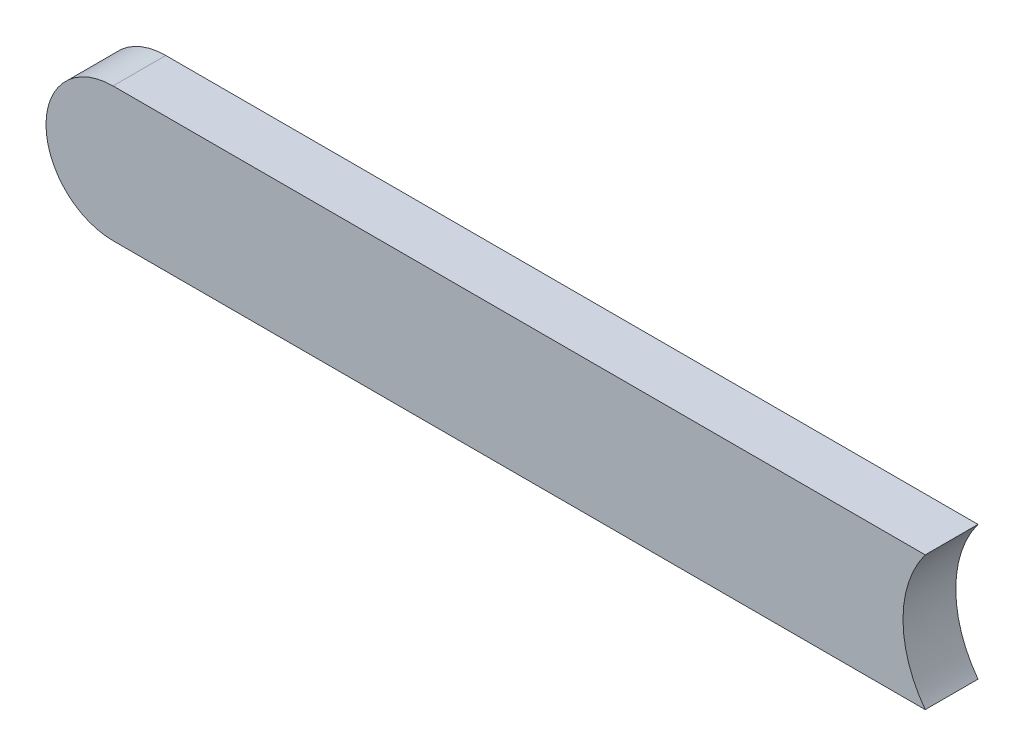
ISO-10303-21;
HEADER;
FILE_DESCRIPTION(('STEP AP214'),'2;1');
FILE_NAME('part.step','',(''),(''),'','','');
FILE_SCHEMA(('AUTOMOTIVE_DESIGN { 1 0 10303 214 1 1 1 1 }'));
ENDSEC;
DATA;
#1=APPLICATION_CONTEXT('core data for automotive mechanical design processes');
#2=APPLICATION_PROTOCOL_DEFINITION('international standard','automotive_design',2000,#1);
#3=PRODUCT_CONTEXT('',#1,'mechanical');
#4=PRODUCT('Part','Part','',(#3));
#5=PRODUCT_RELATED_PRODUCT_CATEGORY('part','',(#4));
#6=PRODUCT_DEFINITION_FORMATION('','',#4);
#7=PRODUCT_DEFINITION_CONTEXT('part definition',#1,'design');
#8=PRODUCT_DEFINITION('design','',#6,#7);
#9=PRODUCT_DEFINITION_SHAPE('','',#8);
#10=(LENGTH_UNIT() NAMED_UNIT(*) SI_UNIT(.MILLI.,.METRE.));
#11=(NAMED_UNIT(*) PLANE_ANGLE_UNIT() SI_UNIT($,.RADIAN.));
#12=(NAMED_UNIT(*) SI_UNIT($,.STERADIAN.) SOLID_ANGLE_UNIT());
#13=UNCERTAINTY_MEASURE_WITH_UNIT(LENGTH_MEASURE(1.E-05),#10,'distance_accuracy_value','');
#14=(GEOMETRIC_REPRESENTATION_CONTEXT(3) GLOBAL_UNCERTAINTY_ASSIGNED_CONTEXT((#13)) GLOBAL_UNIT_ASSIGNED_CONTEXT((#10,
#11,#12)) REPRESENTATION_CONTEXT('',''));
#15=CARTESIAN_POINT('',(0.,0.,0.));
#16=DIRECTION('',(0.,0.,1.));
#17=DIRECTION('',(1.,0.,0.));
#18=AXIS2_PLACEMENT_3D('',#15,#16,#17);
#19=CARTESIAN_POINT('',(146.4413632,64.555624,0.));
#20=DIRECTION('',(0.,1.,0.));
#21=DIRECTION('',(1.,0.,0.));
#22=AXIS2_PLACEMENT_3D('',#19,#20,#21);
#23=PLANE('',#22);
#24=DIRECTION('',(1.,0.,0.));
#25=VECTOR('',#24,1.);
#26=CARTESIAN_POINT('',(146.4413632,64.555624,0.1999996));
#27=LINE('',#26,#25);
#28=CARTESIAN_POINT('',(146.4413632,64.555624,0.1999996));
#29=VERTEX_POINT('',#28);
#30=CARTESIAN_POINT('',(149.519251768896,64.555624,0.1999996));
#31=VERTEX_POINT('',#30);
#32=EDGE_CURVE('E11',#29,#31,#27,.T.);
#33=ORIENTED_EDGE('',*,*,#32,.F.);
#34=DIRECTION('',(0.,0.,1.));
#35=VECTOR('',#34,1.);
#36=CARTESIAN_POINT('',(146.4413632,64.555624,0.));
#37=LINE('',#36,#35);
#38=CARTESIAN_POINT('',(146.4413632,64.555624,0.));
#39=VERTEX_POINT('',#38);
#40=EDGE_CURVE('E24',#39,#29,#37,.T.);
#41=ORIENTED_EDGE('',*,*,#40,.F.);
#42=DIRECTION('',(1.,0.,0.));
#43=VECTOR('',#42,1.);
#44=CARTESIAN_POINT('',(146.4413632,64.555624,0.));
#45=LINE('',#44,#43);
#46=CARTESIAN_POINT('',(149.519251768896,64.555624,0.));
#47=VERTEX_POINT('',#46);
#48=EDGE_CURVE('E75',#39,#47,#45,.T.);
#49=ORIENTED_EDGE('',*,*,#48,.T.);
#50=DIRECTION('',(0.,0.,1.));
#51=VECTOR('',#50,1.);
#52=CARTESIAN_POINT('',(149.519251768896,64.555624,0.));
#53=LINE('',#52,#51);
#54=EDGE_CURVE('E37',#47,#31,#53,.T.);
#55=ORIENTED_EDGE('',*,*,#54,.T.);
#56=EDGE_LOOP('',(#33,#41,#49,#55));
#57=FACE_BOUND('',#56,.T.);
#58=ADVANCED_FACE('F17',(#57),#23,.F.);
#59=CARTESIAN_POINT('',(149.86,64.809624,0.));
#60=DIRECTION('',(0.,0.,-1.));
#61=DIRECTION('',(1.,0.,0.));
#62=AXIS2_PLACEMENT_3D('',#59,#60,#61);
#63=CYLINDRICAL_SURFACE('',#62,0.42500042);
#64=DIRECTION('',(0.,0.,1.));
#65=VECTOR('',#64,1.);
#66=CARTESIAN_POINT('',(149.519251768896,65.063624,0.));
#67=LINE('',#66,#65);
#68=CARTESIAN_POINT('',(149.519251768896,65.063624,0.));
#69=VERTEX_POINT('',#68);
#70=CARTESIAN_POINT('',(149.519251768896,65.063624,0.1999996));
#71=VERTEX_POINT('',#70);
#72=EDGE_CURVE('E67',#69,#71,#67,.T.);
#73=ORIENTED_EDGE('',*,*,#72,.T.);
#74=CARTESIAN_POINT('',(149.86,64.809624,0.1999996));
#75=DIRECTION('',(0.,0.,1.));
#76=DIRECTION('',(1.,0.,0.));
#77=AXIS2_PLACEMENT_3D('',#74,#75,#76);
#78=CIRCLE('',#77,0.42500042);
#79=EDGE_CURVE('E82',#71,#31,#78,.T.);
#80=ORIENTED_EDGE('',*,*,#79,.T.);
#81=ORIENTED_EDGE('',*,*,#54,.F.);
#82=CARTESIAN_POINT('',(149.86,64.809624,0.));
#83=DIRECTION('',(0.,0.,1.));
#84=DIRECTION('',(1.,0.,0.));
#85=AXIS2_PLACEMENT_3D('',#82,#83,#84);
#86=CIRCLE('',#85,0.42500042);
#87=EDGE_CURVE('E80',#69,#47,#86,.T.);
#88=ORIENTED_EDGE('',*,*,#87,.F.);
#89=EDGE_LOOP('',(#73,#80,#81,#88));
#90=FACE_BOUND('',#89,.T.);
#91=ADVANCED_FACE('F88',(#90),#63,.F.);
#92=CARTESIAN_POINT('',(149.519251768896,65.063624,0.));
#93=DIRECTION('',(0.,-1.,0.));
#94=DIRECTION('',(-1.,0.,0.));
#95=AXIS2_PLACEMENT_3D('',#92,#93,#94);
#96=PLANE('',#95);
#97=DIRECTION('',(-1.,0.,0.));
#98=VECTOR('',#97,1.);
#99=CARTESIAN_POINT('',(149.86,65.063624,0.1999996));
#100=LINE('',#99,#98);
#101=CARTESIAN_POINT('',(146.4413632,65.063624,0.1999996));
#102=VERTEX_POINT('',#101);
#103=EDGE_CURVE('E71',#71,#102,#100,.T.);
#104=ORIENTED_EDGE('',*,*,#103,.F.);
#105=ORIENTED_EDGE('',*,*,#72,.F.);
#106=DIRECTION('',(-1.,0.,0.));
#107=VECTOR('',#106,1.);
#108=CARTESIAN_POINT('',(149.86,65.063624,0.));
#109=LINE('',#108,#107);
#110=CARTESIAN_POINT('',(146.4413632,65.063624,0.));
#111=VERTEX_POINT('',#110);
#112=EDGE_CURVE('E63',#69,#111,#109,.T.);
#113=ORIENTED_EDGE('',*,*,#112,.T.);
#114=DIRECTION('',(0.,0.,1.));
#115=VECTOR('',#114,1.);
#116=CARTESIAN_POINT('',(146.4413632,65.063624,0.));
#117=LINE('',#116,#115);
#118=EDGE_CURVE('E53',#111,#102,#117,.T.);
#119=ORIENTED_EDGE('',*,*,#118,.T.);
#120=EDGE_LOOP('',(#104,#105,#113,#119));
#121=FACE_BOUND('',#120,.T.);
#122=ADVANCED_FACE('F66',(#121),#96,.F.);
#123=CARTESIAN_POINT('',(146.4413632,64.809624,0.));
#124=DIRECTION('',(0.,0.,-1.));
#125=DIRECTION('',(1.11896493820486E-13,1.,0.));
#126=AXIS2_PLACEMENT_3D('',#123,#124,#125);
#127=CYLINDRICAL_SURFACE('',#126,0.254);
#128=CARTESIAN_POINT('',(146.4413632,64.809624,0.1999996));
#129=DIRECTION('',(0.,0.,1.));
#130=DIRECTION('',(1.11896493820486E-13,1.,0.));
#131=AXIS2_PLACEMENT_3D('',#128,#129,#130);
#132=CIRCLE('',#131,0.254);
#133=EDGE_CURVE('E59',#102,#29,#132,.T.);
#134=ORIENTED_EDGE('',*,*,#133,.F.);
#135=ORIENTED_EDGE('',*,*,#118,.F.);
#136=CARTESIAN_POINT('',(146.4413632,64.809624,0.));
#137=DIRECTION('',(0.,0.,1.));
#138=DIRECTION('',(1.11896493820486E-13,1.,0.));
#139=AXIS2_PLACEMENT_3D('',#136,#137,#138);
#140=CIRCLE('',#139,0.254);
#141=EDGE_CURVE('E57',#111,#39,#140,.T.);
#142=ORIENTED_EDGE('',*,*,#141,.T.);
#143=ORIENTED_EDGE('',*,*,#40,.T.);
#144=EDGE_LOOP('',(#134,#135,#142,#143));
#145=FACE_BOUND('',#144,.T.);
#146=ADVANCED_FACE('F55',(#145),#127,.T.);
#147=CARTESIAN_POINT('',(146.4413632,64.555624,0.));
#148=DIRECTION('',(0.,0.,-1.));
#149=DIRECTION('',(-1.,0.,0.));
#150=AXIS2_PLACEMENT_3D('',#147,#148,#149);
#151=PLANE('',#150);
#152=ORIENTED_EDGE('',*,*,#48,.F.);
#153=ORIENTED_EDGE('',*,*,#141,.F.);
#154=ORIENTED_EDGE('',*,*,#112,.F.);
#155=ORIENTED_EDGE('',*,*,#87,.T.);
#156=EDGE_LOOP('',(#152,#153,#154,#155));
#157=FACE_BOUND('',#156,.T.);
#158=ADVANCED_FACE('F74',(#157),#151,.T.);
#159=CARTESIAN_POINT('',(146.4413632,64.555624,0.1999996));
#160=DIRECTION('',(0.,0.,-1.));
#161=DIRECTION('',(-1.,0.,0.));
#162=AXIS2_PLACEMENT_3D('',#159,#160,#161);
#163=PLANE('',#162);
#164=ORIENTED_EDGE('',*,*,#133,.T.);
#165=ORIENTED_EDGE('',*,*,#32,.T.);
#166=ORIENTED_EDGE('',*,*,#79,.F.);
#167=ORIENTED_EDGE('',*,*,#103,.T.);
#168=EDGE_LOOP('',(#164,#165,#166,#167));
#169=FACE_BOUND('',#168,.T.);
#170=ADVANCED_FACE('F91',(#169),#163,.F.);
#171=CLOSED_SHELL('',(#58,#91,#122,#146,#158,#170));
#172=MANIFOLD_SOLID_BREP('B1',#171);
#173=ADVANCED_BREP_SHAPE_REPRESENTATION('',(#18,#172),#14);
#174=SHAPE_DEFINITION_REPRESENTATION(#9,#173);
ENDSEC;
END-ISO-10303-21;
